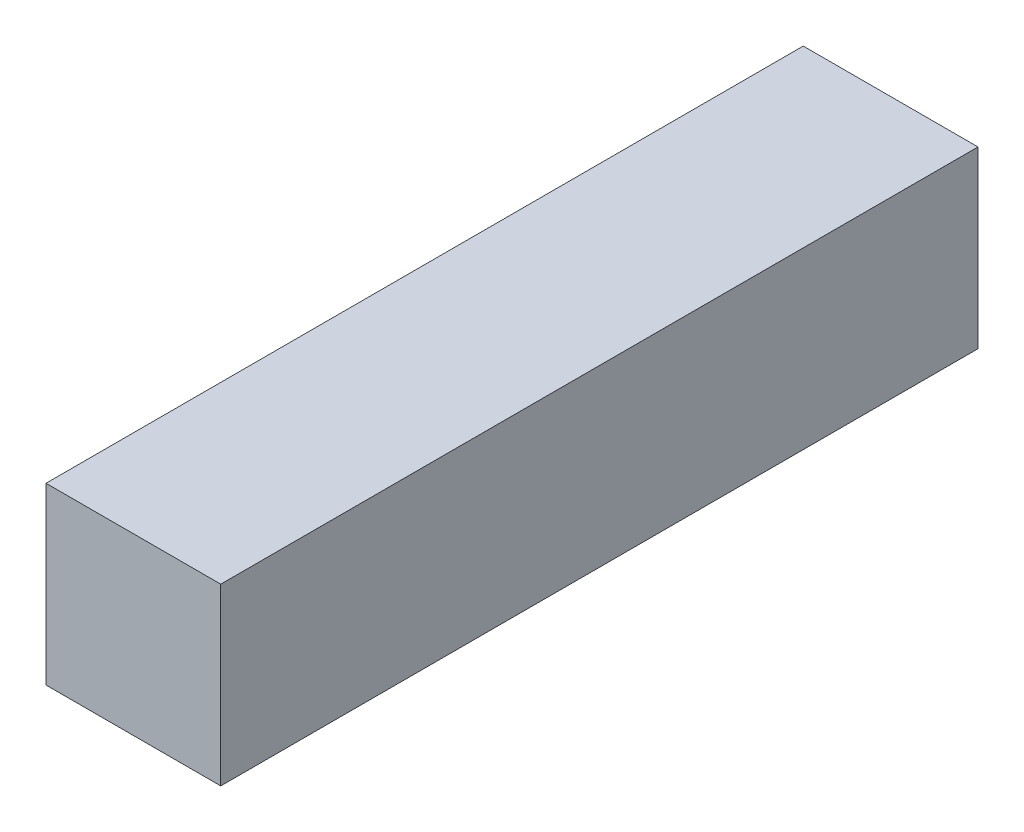
ISO-10303-21;
HEADER;
FILE_DESCRIPTION(('STEP AP214'),'2;1');
FILE_NAME('part.step','',(''),(''),'','','');
FILE_SCHEMA(('AUTOMOTIVE_DESIGN { 1 0 10303 214 1 1 1 1 }'));
ENDSEC;
DATA;
#1=APPLICATION_CONTEXT('core data for automotive mechanical design processes');
#2=APPLICATION_PROTOCOL_DEFINITION('international standard','automotive_design',2000,#1);
#3=PRODUCT_CONTEXT('',#1,'mechanical');
#4=PRODUCT('Part','Part','',(#3));
#5=PRODUCT_RELATED_PRODUCT_CATEGORY('part','',(#4));
#6=PRODUCT_DEFINITION_FORMATION('','',#4);
#7=PRODUCT_DEFINITION_CONTEXT('part definition',#1,'design');
#8=PRODUCT_DEFINITION('design','',#6,#7);
#9=PRODUCT_DEFINITION_SHAPE('','',#8);
#10=(LENGTH_UNIT() NAMED_UNIT(*) SI_UNIT(.MILLI.,.METRE.));
#11=(NAMED_UNIT(*) PLANE_ANGLE_UNIT() SI_UNIT($,.RADIAN.));
#12=(NAMED_UNIT(*) SI_UNIT($,.STERADIAN.) SOLID_ANGLE_UNIT());
#13=UNCERTAINTY_MEASURE_WITH_UNIT(LENGTH_MEASURE(1.E-05),#10,'distance_accuracy_value','');
#14=(GEOMETRIC_REPRESENTATION_CONTEXT(3) GLOBAL_UNCERTAINTY_ASSIGNED_CONTEXT((#13)) GLOBAL_UNIT_ASSIGNED_CONTEXT((#10,
#11,#12)) REPRESENTATION_CONTEXT('',''));
#15=CARTESIAN_POINT('',(0.,0.,0.));
#16=DIRECTION('',(0.,0.,1.));
#17=DIRECTION('',(1.,0.,0.));
#18=AXIS2_PLACEMENT_3D('',#15,#16,#17);
#19=CARTESIAN_POINT('',(-74.0741634491635,30.5952380952381,130.));
#20=DIRECTION('',(1.,0.,0.));
#21=DIRECTION('',(0.,0.,-1.));
#22=AXIS2_PLACEMENT_3D('',#19,#20,#21);
#23=PLANE('',#22);
#24=DIRECTION('',(0.,-1.,0.));
#25=VECTOR('',#24,1.);
#26=CARTESIAN_POINT('',(-74.0741634491635,30.5952380952381,0.));
#27=LINE('',#26,#25);
#28=CARTESIAN_POINT('',(-74.0741634491635,30.5952380952381,0.));
#29=VERTEX_POINT('',#28);
#30=CARTESIAN_POINT('',(-74.0741634491635,0.595238095238117,0.));
#31=VERTEX_POINT('',#30);
#32=EDGE_CURVE('E107',#29,#31,#27,.T.);
#33=ORIENTED_EDGE('',*,*,#32,.T.);
#34=DIRECTION('',(0.,0.,-1.));
#35=VECTOR('',#34,1.);
#36=CARTESIAN_POINT('',(-74.0741634491635,0.595238095238117,130.));
#37=LINE('',#36,#35);
#38=CARTESIAN_POINT('',(-74.0741634491635,0.595238095238117,130.));
#39=VERTEX_POINT('',#38);
#40=EDGE_CURVE('E11',#39,#31,#37,.T.);
#41=ORIENTED_EDGE('',*,*,#40,.F.);
#42=DIRECTION('',(0.,-1.,0.));
#43=VECTOR('',#42,1.);
#44=CARTESIAN_POINT('',(-74.0741634491635,30.5952380952381,130.));
#45=LINE('',#44,#43);
#46=CARTESIAN_POINT('',(-74.0741634491635,30.5952380952381,130.));
#47=VERTEX_POINT('',#46);
#48=EDGE_CURVE('E91',#47,#39,#45,.T.);
#49=ORIENTED_EDGE('',*,*,#48,.F.);
#50=DIRECTION('',(0.,0.,-1.));
#51=VECTOR('',#50,1.);
#52=CARTESIAN_POINT('',(-74.0741634491635,30.5952380952381,130.));
#53=LINE('',#52,#51);
#54=EDGE_CURVE('E103',#47,#29,#53,.T.);
#55=ORIENTED_EDGE('',*,*,#54,.T.);
#56=EDGE_LOOP('',(#33,#41,#49,#55));
#57=FACE_BOUND('',#56,.T.);
#58=ADVANCED_FACE('F39',(#57),#23,.F.);
#59=CARTESIAN_POINT('',(-74.0741634491635,0.595238095238117,130.));
#60=DIRECTION('',(0.,1.,0.));
#61=DIRECTION('',(0.,0.,1.));
#62=AXIS2_PLACEMENT_3D('',#59,#60,#61);
#63=PLANE('',#62);
#64=DIRECTION('',(1.,0.,0.));
#65=VECTOR('',#64,1.);
#66=CARTESIAN_POINT('',(-74.0741634491635,0.595238095238117,0.));
#67=LINE('',#66,#65);
#68=CARTESIAN_POINT('',(-44.0741634491635,0.595238095238117,0.));
#69=VERTEX_POINT('',#68);
#70=EDGE_CURVE('E96',#31,#69,#67,.T.);
#71=ORIENTED_EDGE('',*,*,#70,.T.);
#72=DIRECTION('',(0.,0.,-1.));
#73=VECTOR('',#72,1.);
#74=CARTESIAN_POINT('',(-44.0741634491635,0.595238095238117,130.));
#75=LINE('',#74,#73);
#76=CARTESIAN_POINT('',(-44.0741634491635,0.595238095238117,130.));
#77=VERTEX_POINT('',#76);
#78=EDGE_CURVE('E48',#77,#69,#75,.T.);
#79=ORIENTED_EDGE('',*,*,#78,.F.);
#80=DIRECTION('',(1.,0.,0.));
#81=VECTOR('',#80,1.);
#82=CARTESIAN_POINT('',(-74.0741634491635,0.595238095238117,130.));
#83=LINE('',#82,#81);
#84=EDGE_CURVE('E86',#39,#77,#83,.T.);
#85=ORIENTED_EDGE('',*,*,#84,.F.);
#86=ORIENTED_EDGE('',*,*,#40,.T.);
#87=EDGE_LOOP('',(#71,#79,#85,#86));
#88=FACE_BOUND('',#87,.T.);
#89=ADVANCED_FACE('F95',(#88),#63,.F.);
#90=CARTESIAN_POINT('',(-44.0741634491635,30.5952380952381,130.));
#91=DIRECTION('',(-1.,0.,0.));
#92=DIRECTION('',(0.,-1.,0.));
#93=AXIS2_PLACEMENT_3D('',#90,#91,#92);
#94=PLANE('',#93);
#95=DIRECTION('',(0.,1.,0.));
#96=VECTOR('',#95,1.);
#97=CARTESIAN_POINT('',(-44.0741634491635,30.5952380952381,0.));
#98=LINE('',#97,#96);
#99=CARTESIAN_POINT('',(-44.0741634491635,30.5952380952381,0.));
#100=VERTEX_POINT('',#99);
#101=EDGE_CURVE('E73',#69,#100,#98,.T.);
#102=ORIENTED_EDGE('',*,*,#101,.T.);
#103=DIRECTION('',(0.,0.,-1.));
#104=VECTOR('',#103,1.);
#105=CARTESIAN_POINT('',(-44.0741634491635,30.5952380952381,130.));
#106=LINE('',#105,#104);
#107=CARTESIAN_POINT('',(-44.0741634491635,30.5952380952381,130.));
#108=VERTEX_POINT('',#107);
#109=EDGE_CURVE('E98',#108,#100,#106,.T.);
#110=ORIENTED_EDGE('',*,*,#109,.F.);
#111=DIRECTION('',(0.,1.,0.));
#112=VECTOR('',#111,1.);
#113=CARTESIAN_POINT('',(-44.0741634491635,30.5952380952381,130.));
#114=LINE('',#113,#112);
#115=EDGE_CURVE('E89',#77,#108,#114,.T.);
#116=ORIENTED_EDGE('',*,*,#115,.F.);
#117=ORIENTED_EDGE('',*,*,#78,.T.);
#118=EDGE_LOOP('',(#102,#110,#116,#117));
#119=FACE_BOUND('',#118,.T.);
#120=ADVANCED_FACE('F99',(#119),#94,.F.);
#121=CARTESIAN_POINT('',(-74.0741634491635,30.5952380952381,130.));
#122=DIRECTION('',(0.,-1.,0.));
#123=DIRECTION('',(0.,0.,-1.));
#124=AXIS2_PLACEMENT_3D('',#121,#122,#123);
#125=PLANE('',#124);
#126=DIRECTION('',(-1.,0.,0.));
#127=VECTOR('',#126,1.);
#128=CARTESIAN_POINT('',(-74.0741634491635,30.5952380952381,0.));
#129=LINE('',#128,#127);
#130=EDGE_CURVE('E79',#100,#29,#129,.T.);
#131=ORIENTED_EDGE('',*,*,#130,.T.);
#132=ORIENTED_EDGE('',*,*,#54,.F.);
#133=DIRECTION('',(-1.,0.,0.));
#134=VECTOR('',#133,1.);
#135=CARTESIAN_POINT('',(-74.0741634491635,30.5952380952381,130.));
#136=LINE('',#135,#134);
#137=EDGE_CURVE('E56',#108,#47,#136,.T.);
#138=ORIENTED_EDGE('',*,*,#137,.F.);
#139=ORIENTED_EDGE('',*,*,#109,.T.);
#140=EDGE_LOOP('',(#131,#132,#138,#139));
#141=FACE_BOUND('',#140,.T.);
#142=ADVANCED_FACE('F120',(#141),#125,.F.);
#143=CARTESIAN_POINT('',(0.,0.,130.));
#144=DIRECTION('',(0.,0.,1.));
#145=DIRECTION('',(1.,0.,0.));
#146=AXIS2_PLACEMENT_3D('',#143,#144,#145);
#147=PLANE('',#146);
#148=ORIENTED_EDGE('',*,*,#48,.T.);
#149=ORIENTED_EDGE('',*,*,#84,.T.);
#150=ORIENTED_EDGE('',*,*,#115,.T.);
#151=ORIENTED_EDGE('',*,*,#137,.T.);
#152=EDGE_LOOP('',(#148,#149,#150,#151));
#153=FACE_BOUND('',#152,.T.);
#154=ADVANCED_FACE('F87',(#153),#147,.T.);
#155=CARTESIAN_POINT('',(0.,0.,0.));
#156=DIRECTION('',(0.,0.,1.));
#157=DIRECTION('',(1.,0.,0.));
#158=AXIS2_PLACEMENT_3D('',#155,#156,#157);
#159=PLANE('',#158);
#160=ORIENTED_EDGE('',*,*,#32,.F.);
#161=ORIENTED_EDGE('',*,*,#130,.F.);
#162=ORIENTED_EDGE('',*,*,#101,.F.);
#163=ORIENTED_EDGE('',*,*,#70,.F.);
#164=EDGE_LOOP('',(#160,#161,#162,#163));
#165=FACE_BOUND('',#164,.T.);
#166=ADVANCED_FACE('F123',(#165),#159,.F.);
#167=CLOSED_SHELL('',(#58,#89,#120,#142,#154,#166));
#168=MANIFOLD_SOLID_BREP('B2',#167);
#169=ADVANCED_BREP_SHAPE_REPRESENTATION('',(#18,#168),#14);
#170=SHAPE_DEFINITION_REPRESENTATION(#9,#169);
ENDSEC;
END-ISO-10303-21;
